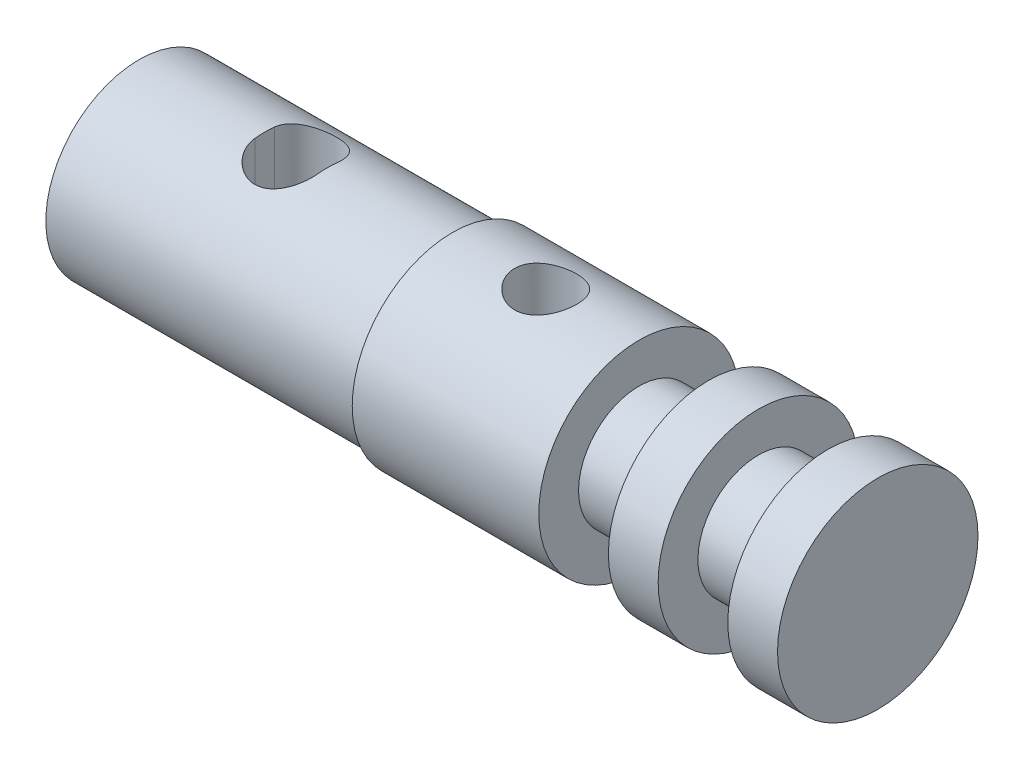
ISO-10303-21;
HEADER;
FILE_DESCRIPTION(('STEP AP214'),'2;1');
FILE_NAME('part.step','',(''),(''),'','','');
FILE_SCHEMA(('AUTOMOTIVE_DESIGN { 1 0 10303 214 1 1 1 1 }'));
ENDSEC;
DATA;
#1=APPLICATION_CONTEXT('core data for automotive mechanical design processes');
#2=APPLICATION_PROTOCOL_DEFINITION('international standard','automotive_design',2000,#1);
#3=PRODUCT_CONTEXT('',#1,'mechanical');
#4=PRODUCT('Part','Part','',(#3));
#5=PRODUCT_RELATED_PRODUCT_CATEGORY('part','',(#4));
#6=PRODUCT_DEFINITION_FORMATION('','',#4);
#7=PRODUCT_DEFINITION_CONTEXT('part definition',#1,'design');
#8=PRODUCT_DEFINITION('design','',#6,#7);
#9=PRODUCT_DEFINITION_SHAPE('','',#8);
#10=(LENGTH_UNIT() NAMED_UNIT(*) SI_UNIT(.MILLI.,.METRE.));
#11=(NAMED_UNIT(*) PLANE_ANGLE_UNIT() SI_UNIT($,.RADIAN.));
#12=(NAMED_UNIT(*) SI_UNIT($,.STERADIAN.) SOLID_ANGLE_UNIT());
#13=UNCERTAINTY_MEASURE_WITH_UNIT(LENGTH_MEASURE(1.E-05),#10,'distance_accuracy_value','');
#14=(GEOMETRIC_REPRESENTATION_CONTEXT(3) GLOBAL_UNCERTAINTY_ASSIGNED_CONTEXT((#13)) GLOBAL_UNIT_ASSIGNED_CONTEXT((#10,
#11,#12)) REPRESENTATION_CONTEXT('',''));
#15=CARTESIAN_POINT('',(0.,0.,0.));
#16=DIRECTION('',(0.,0.,1.));
#17=DIRECTION('',(1.,0.,0.));
#18=AXIS2_PLACEMENT_3D('',#15,#16,#17);
#19=CARTESIAN_POINT('',(-18.8585,0.,0.));
#20=DIRECTION('',(-1.,0.,0.));
#21=DIRECTION('',(0.,-1.,0.));
#22=AXIS2_PLACEMENT_3D('',#19,#20,#21);
#23=CYLINDRICAL_SURFACE('',#22,4.7625);
#24=CARTESIAN_POINT('',(-9.27100000000001,0.,0.));
#25=DIRECTION('',(-1.,0.,0.));
#26=DIRECTION('',(0.,-1.,0.));
#27=AXIS2_PLACEMENT_3D('',#24,#25,#26);
#28=CIRCLE('',#27,4.7625);
#29=CARTESIAN_POINT('',(-9.27100000000001,-4.73618066061663,-0.499999));
#30=VERTEX_POINT('',#29);
#31=CARTESIAN_POINT('',(-9.27100000000001,-4.73618066061663,0.499999));
#32=VERTEX_POINT('',#31);
#33=EDGE_CURVE('E125',#30,#32,#28,.T.);
#34=ORIENTED_EDGE('',*,*,#33,.F.);
#35=CARTESIAN_POINT('',(-9.271,-4.73618066061663,-0.499999));
#36=CARTESIAN_POINT('',(-9.27099900401879,-4.73149074957856,-0.544457113914548));
#37=CARTESIAN_POINT('',(-9.27286857671888,-4.72616979555771,-0.588823368380355));
#38=CARTESIAN_POINT('',(-9.28028499532807,-4.71433532449615,-0.677070814495245));
#39=CARTESIAN_POINT('',(-9.28583047912616,-4.70782224984331,-0.720952179699209));
#40=CARTESIAN_POINT('',(-9.30782761466854,-4.68665043825978,-0.851114215765219));
#41=CARTESIAN_POINT('',(-9.32964108379015,-4.67031999946661,-0.936277481682504));
#42=CARTESIAN_POINT('',(-9.38660216002771,-4.63424124740617,-1.10106514117091));
#43=CARTESIAN_POINT('',(-9.4217360664164,-4.61449645727916,-1.18069512674852));
#44=CARTESIAN_POINT('',(-9.50422379883291,-4.57288021799495,-1.33281533585361));
#45=CARTESIAN_POINT('',(-9.55158736122072,-4.55100708309077,-1.40529980681844));
#46=CARTESIAN_POINT('',(-9.65973672927317,-4.50567874360616,-1.54462863552813));
#47=CARTESIAN_POINT('',(-9.72103451625751,-4.48219680753337,-1.61106721460725));
#48=CARTESIAN_POINT('',(-9.85428731182231,-4.43654809058827,-1.7328248973506));
#49=CARTESIAN_POINT('',(-9.92624474941494,-4.41438161108545,-1.78814145985334));
#50=CARTESIAN_POINT('',(-10.0804386081246,-4.37312454910467,-1.88682267534422));
#51=CARTESIAN_POINT('',(-10.1628165503131,-4.35408672777652,-1.92998965839575));
#52=CARTESIAN_POINT('',(-10.3347950900228,-4.32167924492782,-2.00151257224924));
#53=CARTESIAN_POINT('',(-10.4243898259785,-4.3083050375166,-2.02988038583927));
#54=CARTESIAN_POINT('',(-10.6008831163809,-4.28971640151308,-2.0688578018687));
#55=CARTESIAN_POINT('',(-10.6874584269842,-4.28395316206478,-2.08066616262955));
#56=CARTESIAN_POINT('',(-10.8615391323911,-4.27946539742106,-2.08988386938572));
#57=CARTESIAN_POINT('',(-10.949044093646,-4.28073772356283,-2.08729965655974));
#58=CARTESIAN_POINT('',(-11.1156619012393,-4.28979667399263,-2.06860790446478));
#59=CARTESIAN_POINT('',(-11.1949182147864,-4.29709668291484,-2.05351024259698));
#60=CARTESIAN_POINT('',(-11.3496419002255,-4.31680883072445,-2.01173966499303));
#61=CARTESIAN_POINT('',(-11.4251086088033,-4.32922186109547,-1.98506473065171));
#62=CARTESIAN_POINT('',(-11.5729457873644,-4.3584668662552,-1.92002047325914));
#63=CARTESIAN_POINT('',(-11.6451326443969,-4.37543081548205,-1.88129520310794));
#64=CARTESIAN_POINT('',(-11.7822412799547,-4.41209075335578,-1.79363196292506));
#65=CARTESIAN_POINT('',(-11.8471602866535,-4.43178777797798,-1.74469011672339));
#66=CARTESIAN_POINT('',(-11.9742017056361,-4.47429966011795,-1.63277317400261));
#67=CARTESIAN_POINT('',(-12.0355114232409,-4.49723443599243,-1.56891924996947));
#68=CARTESIAN_POINT('',(-12.1467807022487,-4.54274331137461,-1.43181854778151));
#69=CARTESIAN_POINT('',(-12.196733940171,-4.56531720346459,-1.35856657196782));
#70=CARTESIAN_POINT('',(-12.285818565146,-4.60932632886207,-1.20103343674307));
#71=CARTESIAN_POINT('',(-12.3244027993718,-4.63067300410263,-1.11641680941919));
#72=CARTESIAN_POINT('',(-12.3863340533842,-4.66946691019947,-0.941014289018639));
#73=CARTESIAN_POINT('',(-12.4097071097766,-4.68692077044499,-0.850239232921642));
#74=CARTESIAN_POINT('',(-12.4319175886234,-4.70866798330001,-0.71534591868991));
#75=CARTESIAN_POINT('',(-12.437188325447,-4.71497573057759,-0.672527668170264));
#76=CARTESIAN_POINT('',(-12.4442275086746,-4.72644731574368,-0.586502061087986));
#77=CARTESIAN_POINT('',(-12.4459998763684,-4.73161242862544,-0.543295194776926));
#78=CARTESIAN_POINT('',(-12.446,-4.73618066061663,-0.499998999999999));
#79=B_SPLINE_CURVE_WITH_KNOTS('',3,(#35,#36,#37,#38,#39,#40,#41,#42,#43,#44,#45,#46,#47,#48,#49,
#50,#51,#52,#53,#54,#55,#56,#57,#58,#59,#60,#61,#62,#63,#64,#65,#66,#67,#68,#69,#70,#71,#72,#73,
#74,#75,#76,#77,#78),.UNSPECIFIED.,.F.,.F.,(4,2,2,2,2,2,2,2,2,2,2,2,2,2,2,2,2,2,2,2,2,4),(0.,
0.134023190107669,0.267996745584812,0.534858400956082,0.801446317321887,1.06824712946625,
1.34716758336556,1.62615169285082,1.90944220061474,2.19250489273292,2.45378087211084,
2.71493993077345,2.95686712657952,3.19883652159975,3.44876853385342,3.69879554324353,
3.97192549543557,4.24520716054719,4.5300487800395,4.81440155166159,4.9450673996194,
5.07558670206719),.UNSPECIFIED.);
#80=CARTESIAN_POINT('',(-12.446,-4.73618066061663,-0.499999));
#81=VERTEX_POINT('',#80);
#82=EDGE_CURVE('E166',#30,#81,#79,.T.);
#83=ORIENTED_EDGE('',*,*,#82,.T.);
#84=CARTESIAN_POINT('',(-12.446,0.,0.));
#85=DIRECTION('',(-1.,0.,0.));
#86=DIRECTION('',(0.,0.,1.));
#87=AXIS2_PLACEMENT_3D('',#84,#85,#86);
#88=CIRCLE('',#87,4.7625);
#89=CARTESIAN_POINT('',(-12.446,-4.73618066061663,0.499999));
#90=VERTEX_POINT('',#89);
#91=EDGE_CURVE('E154',#81,#90,#88,.T.);
#92=ORIENTED_EDGE('',*,*,#91,.T.);
#93=CARTESIAN_POINT('',(-12.446,-4.73618066061663,0.499999));
#94=CARTESIAN_POINT('',(-12.4460009959812,-4.73149074957856,0.544457113914548));
#95=CARTESIAN_POINT('',(-12.4441314232811,-4.72616979555771,0.588823368380356));
#96=CARTESIAN_POINT('',(-12.4367150046719,-4.71433532449615,0.677070814495245));
#97=CARTESIAN_POINT('',(-12.4311695208738,-4.70782224984331,0.72095217969921));
#98=CARTESIAN_POINT('',(-12.4091723853315,-4.68665043825978,0.851114215765219));
#99=CARTESIAN_POINT('',(-12.3873589162099,-4.67031999946661,0.936277481682504));
#100=CARTESIAN_POINT('',(-12.3303978399723,-4.63424124740617,1.10106514117091));
#101=CARTESIAN_POINT('',(-12.2952639335836,-4.61449645727916,1.18069512674852));
#102=CARTESIAN_POINT('',(-12.2127762011671,-4.57288021799495,1.33281533585361));
#103=CARTESIAN_POINT('',(-12.1654126387793,-4.55100708309077,1.40529980681844));
#104=CARTESIAN_POINT('',(-12.0572632707268,-4.50567874360616,1.54462863552813));
#105=CARTESIAN_POINT('',(-11.9959654837425,-4.48219680753337,1.61106721460725));
#106=CARTESIAN_POINT('',(-11.8627126881777,-4.43654809058827,1.7328248973506));
#107=CARTESIAN_POINT('',(-11.7907552505851,-4.41438161108545,1.78814145985334));
#108=CARTESIAN_POINT('',(-11.6365613918754,-4.37312454910467,1.88682267534422));
#109=CARTESIAN_POINT('',(-11.5541834496869,-4.35408672777652,1.92998965839575));
#110=CARTESIAN_POINT('',(-11.3822049099772,-4.32167924492783,2.00151257224924));
#111=CARTESIAN_POINT('',(-11.2926101740215,-4.3083050375166,2.02988038583927));
#112=CARTESIAN_POINT('',(-11.1161168836191,-4.28971640151308,2.0688578018687));
#113=CARTESIAN_POINT('',(-11.0295415730158,-4.28395316206478,2.08066616262955));
#114=CARTESIAN_POINT('',(-10.8554608676089,-4.27946539742106,2.08988386938572));
#115=CARTESIAN_POINT('',(-10.767955906354,-4.28073772356283,2.08729965655974));
#116=CARTESIAN_POINT('',(-10.6013380987607,-4.28979667399263,2.06860790446478));
#117=CARTESIAN_POINT('',(-10.5220817852136,-4.29709668291484,2.05351024259698));
#118=CARTESIAN_POINT('',(-10.3673580997745,-4.31680883072445,2.01173966499303));
#119=CARTESIAN_POINT('',(-10.2918913911967,-4.32922186109547,1.98506473065171));
#120=CARTESIAN_POINT('',(-10.1440542126356,-4.3584668662552,1.92002047325914));
#121=CARTESIAN_POINT('',(-10.0718673556031,-4.37543081548205,1.88129520310794));
#122=CARTESIAN_POINT('',(-9.93475872004533,-4.41209075335578,1.79363196292506));
#123=CARTESIAN_POINT('',(-9.8698397133465,-4.43178777797798,1.74469011672339));
#124=CARTESIAN_POINT('',(-9.74279829436393,-4.47429966011795,1.63277317400261));
#125=CARTESIAN_POINT('',(-9.68148857675908,-4.49723443599243,1.56891924996947));
#126=CARTESIAN_POINT('',(-9.57021929775134,-4.54274331137461,1.4318185477815));
#127=CARTESIAN_POINT('',(-9.52026605982898,-4.56531720346459,1.35856657196782));
#128=CARTESIAN_POINT('',(-9.43118143485397,-4.60932632886207,1.20103343674307));
#129=CARTESIAN_POINT('',(-9.39259720062818,-4.63067300410263,1.11641680941919));
#130=CARTESIAN_POINT('',(-9.33066594661583,-4.66946691019947,0.941014289018638));
#131=CARTESIAN_POINT('',(-9.30729289022338,-4.68692077044499,0.850239232921641));
#132=CARTESIAN_POINT('',(-9.28508241137656,-4.70866798330001,0.715345918689909));
#133=CARTESIAN_POINT('',(-9.27981167455298,-4.71497573057759,0.672527668170264));
#134=CARTESIAN_POINT('',(-9.27277249132541,-4.72644731574368,0.586502061087986));
#135=CARTESIAN_POINT('',(-9.27100012363155,-4.73161242862544,0.543295194776926));
#136=CARTESIAN_POINT('',(-9.271,-4.73618066061663,0.499998999999999));
#137=B_SPLINE_CURVE_WITH_KNOTS('',3,(#93,#94,#95,#96,#97,#98,#99,#100,#101,#102,#103,#104,#105,
#106,#107,#108,#109,#110,#111,#112,#113,#114,#115,#116,#117,#118,#119,#120,#121,#122,#123,#124,
#125,#126,#127,#128,#129,#130,#131,#132,#133,#134,#135,#136),.UNSPECIFIED.,.F.,.F.,(4,2,2,2,2,2,
2,2,2,2,2,2,2,2,2,2,2,2,2,2,2,4),(0.,0.134023190107669,0.267996745584813,0.534858400956083,
0.801446317321887,1.06824712946625,1.34716758336556,1.62615169285082,1.90944220061474,
2.19250489273293,2.45378087211085,2.71493993077345,2.95686712657952,3.19883652159975,
3.44876853385342,3.69879554324354,3.97192549543557,4.24520716054719,4.5300487800395,
4.81440155166159,4.9450673996194,5.07558670206719),.UNSPECIFIED.);
#138=EDGE_CURVE('E159',#90,#32,#137,.T.);
#139=ORIENTED_EDGE('',*,*,#138,.T.);
#140=EDGE_LOOP('',(#34,#83,#92,#139));
#141=FACE_BOUND('',#140,.T.);
#142=CARTESIAN_POINT('',(-18.8585,0.,0.));
#143=DIRECTION('',(-1.,0.,0.));
#144=DIRECTION('',(0.,-1.,0.));
#145=AXIS2_PLACEMENT_3D('',#142,#143,#144);
#146=CIRCLE('',#145,4.7625);
#147=CARTESIAN_POINT('',(-18.8585,-4.7625,0.));
#148=VERTEX_POINT('',#147);
#149=EDGE_CURVE('E170',#148,#148,#146,.T.);
#150=ORIENTED_EDGE('',*,*,#149,.F.);
#151=EDGE_LOOP('',(#150));
#152=FACE_BOUND('',#151,.T.);
#153=CARTESIAN_POINT('',(-2.8585,0.,0.));
#154=DIRECTION('',(-1.,0.,0.));
#155=DIRECTION('',(0.,-1.,0.));
#156=AXIS2_PLACEMENT_3D('',#153,#154,#155);
#157=CIRCLE('',#156,4.7625);
#158=CARTESIAN_POINT('',(-2.8585,-4.7625,0.));
#159=VERTEX_POINT('',#158);
#160=EDGE_CURVE('E391',#159,#159,#157,.T.);
#161=ORIENTED_EDGE('',*,*,#160,.T.);
#162=EDGE_LOOP('',(#161));
#163=FACE_BOUND('',#162,.T.);
#164=CARTESIAN_POINT('',(-9.271,4.73618066061663,0.499999));
#165=VERTEX_POINT('',#164);
#166=CARTESIAN_POINT('',(-9.271,4.73618066061663,-0.499999));
#167=VERTEX_POINT('',#166);
#168=EDGE_CURVE('E13',#165,#167,#28,.T.);
#169=ORIENTED_EDGE('',*,*,#168,.F.);
#170=CARTESIAN_POINT('',(-9.271,4.73618066061664,0.499999));
#171=CARTESIAN_POINT('',(-9.27099900401879,4.73149074957856,0.544457113914548));
#172=CARTESIAN_POINT('',(-9.27286857671888,4.72616979555771,0.588823368380355));
#173=CARTESIAN_POINT('',(-9.28028499532807,4.71433532449615,0.677070814495244));
#174=CARTESIAN_POINT('',(-9.28583047912616,4.70782224984332,0.720952179699209));
#175=CARTESIAN_POINT('',(-9.30782761466854,4.68665043825979,0.851114215765219));
#176=CARTESIAN_POINT('',(-9.32964108379015,4.67031999946661,0.936277481682504));
#177=CARTESIAN_POINT('',(-9.38660216002771,4.63424124740617,1.10106514117091));
#178=CARTESIAN_POINT('',(-9.4217360664164,4.61449645727917,1.18069512674852));
#179=CARTESIAN_POINT('',(-9.50422379883291,4.57288021799495,1.33281533585361));
#180=CARTESIAN_POINT('',(-9.55158736122072,4.55100708309078,1.40529980681844));
#181=CARTESIAN_POINT('',(-9.65973672927317,4.50567874360617,1.54462863552813));
#182=CARTESIAN_POINT('',(-9.72103451625751,4.48219680753337,1.61106721460725));
#183=CARTESIAN_POINT('',(-9.85428731182231,4.43654809058828,1.7328248973506));
#184=CARTESIAN_POINT('',(-9.92624474941494,4.41438161108546,1.78814145985334));
#185=CARTESIAN_POINT('',(-10.0804386081246,4.37312454910468,1.88682267534422));
#186=CARTESIAN_POINT('',(-10.1628165503131,4.35408672777652,1.92998965839575));
#187=CARTESIAN_POINT('',(-10.3347950900228,4.32167924492783,2.00151257224924));
#188=CARTESIAN_POINT('',(-10.4243898259785,4.30830503751661,2.02988038583927));
#189=CARTESIAN_POINT('',(-10.6008831163809,4.28971640151309,2.0688578018687));
#190=CARTESIAN_POINT('',(-10.6874584269842,4.28395316206478,2.08066616262955));
#191=CARTESIAN_POINT('',(-10.8615391323911,4.27946539742107,2.08988386938572));
#192=CARTESIAN_POINT('',(-10.949044093646,4.28073772356284,2.08729965655974));
#193=CARTESIAN_POINT('',(-11.1156619012393,4.28979667399263,2.06860790446478));
#194=CARTESIAN_POINT('',(-11.1949182147864,4.29709668291485,2.05351024259698));
#195=CARTESIAN_POINT('',(-11.3496419002255,4.31680883072446,2.01173966499303));
#196=CARTESIAN_POINT('',(-11.4251086088033,4.32922186109547,1.98506473065171));
#197=CARTESIAN_POINT('',(-11.5729457873644,4.35846686625521,1.92002047325914));
#198=CARTESIAN_POINT('',(-11.6451326443969,4.37543081548205,1.88129520310794));
#199=CARTESIAN_POINT('',(-11.7822412799547,4.41209075335579,1.79363196292506));
#200=CARTESIAN_POINT('',(-11.8471602866535,4.43178777797799,1.74469011672339));
#201=CARTESIAN_POINT('',(-11.9742017056361,4.47429966011796,1.63277317400261));
#202=CARTESIAN_POINT('',(-12.0355114232409,4.49723443599244,1.56891924996947));
#203=CARTESIAN_POINT('',(-12.1467807022487,4.54274331137462,1.4318185477815));
#204=CARTESIAN_POINT('',(-12.196733940171,4.56531720346459,1.35856657196782));
#205=CARTESIAN_POINT('',(-12.285818565146,4.60932632886208,1.20103343674307));
#206=CARTESIAN_POINT('',(-12.3244027993718,4.63067300410263,1.11641680941919));
#207=CARTESIAN_POINT('',(-12.3863340533842,4.66946691019948,0.941014289018638));
#208=CARTESIAN_POINT('',(-12.4097071097766,4.686920770445,0.850239232921641));
#209=CARTESIAN_POINT('',(-12.4319175886234,4.70866798330002,0.71534591868991));
#210=CARTESIAN_POINT('',(-12.437188325447,4.7149757305776,0.672527668170265));
#211=CARTESIAN_POINT('',(-12.4442275086746,4.72644731574369,0.586502061087987));
#212=CARTESIAN_POINT('',(-12.4459998763684,4.73161242862544,0.543295194776926));
#213=CARTESIAN_POINT('',(-12.446,4.73618066061664,0.499999));
#214=B_SPLINE_CURVE_WITH_KNOTS('',3,(#170,#171,#172,#173,#174,#175,#176,#177,#178,#179,#180,
#181,#182,#183,#184,#185,#186,#187,#188,#189,#190,#191,#192,#193,#194,#195,#196,#197,#198,#199,
#200,#201,#202,#203,#204,#205,#206,#207,#208,#209,#210,#211,#212,#213),.UNSPECIFIED.,.F.,.F.,(4,
2,2,2,2,2,2,2,2,2,2,2,2,2,2,2,2,2,2,2,2,4),(0.,0.134023190107669,0.267996745584812,
0.534858400956083,0.801446317321887,1.06824712946625,1.34716758336556,1.62615169285082,
1.90944220061474,2.19250489273292,2.45378087211085,2.71493993077346,2.95686712657952,
3.19883652159975,3.44876853385342,3.69879554324354,3.97192549543557,4.24520716054719,
4.5300487800395,4.81440155166159,4.9450673996194,5.07558670206719),.UNSPECIFIED.);
#215=CARTESIAN_POINT('',(-12.446,4.73618066061663,0.499999));
#216=VERTEX_POINT('',#215);
#217=EDGE_CURVE('E381',#165,#216,#214,.T.);
#218=ORIENTED_EDGE('',*,*,#217,.T.);
#219=CARTESIAN_POINT('',(-12.446,4.73618066061663,-0.499999));
#220=VERTEX_POINT('',#219);
#221=EDGE_CURVE('E162',#216,#220,#88,.T.);
#222=ORIENTED_EDGE('',*,*,#221,.T.);
#223=CARTESIAN_POINT('',(-12.446,4.73618066061664,-0.499998999999999));
#224=CARTESIAN_POINT('',(-12.4460009959812,4.73149074957857,-0.544457113914548));
#225=CARTESIAN_POINT('',(-12.4441314232811,4.72616979555771,-0.588823368380355));
#226=CARTESIAN_POINT('',(-12.4367150046719,4.71433532449615,-0.677070814495244));
#227=CARTESIAN_POINT('',(-12.4311695208738,4.70782224984332,-0.720952179699209));
#228=CARTESIAN_POINT('',(-12.4091723853315,4.68665043825979,-0.851114215765218));
#229=CARTESIAN_POINT('',(-12.3873589162099,4.67031999946662,-0.936277481682503));
#230=CARTESIAN_POINT('',(-12.3303978399723,4.63424124740617,-1.10106514117091));
#231=CARTESIAN_POINT('',(-12.2952639335836,4.61449645727917,-1.18069512674852));
#232=CARTESIAN_POINT('',(-12.2127762011671,4.57288021799495,-1.33281533585361));
#233=CARTESIAN_POINT('',(-12.1654126387793,4.55100708309078,-1.40529980681844));
#234=CARTESIAN_POINT('',(-12.0572632707268,4.50567874360617,-1.54462863552813));
#235=CARTESIAN_POINT('',(-11.9959654837425,4.48219680753337,-1.61106721460725));
#236=CARTESIAN_POINT('',(-11.8627126881777,4.43654809058828,-1.73282489735059));
#237=CARTESIAN_POINT('',(-11.7907552505851,4.41438161108546,-1.78814145985334));
#238=CARTESIAN_POINT('',(-11.6365613918754,4.37312454910468,-1.88682267534422));
#239=CARTESIAN_POINT('',(-11.5541834496869,4.35408672777652,-1.92998965839575));
#240=CARTESIAN_POINT('',(-11.3822049099772,4.32167924492783,-2.00151257224924));
#241=CARTESIAN_POINT('',(-11.2926101740215,4.30830503751661,-2.02988038583927));
#242=CARTESIAN_POINT('',(-11.1161168836191,4.28971640151309,-2.0688578018687));
#243=CARTESIAN_POINT('',(-11.0295415730158,4.28395316206478,-2.08066616262955));
#244=CARTESIAN_POINT('',(-10.8554608676089,4.27946539742107,-2.08988386938572));
#245=CARTESIAN_POINT('',(-10.767955906354,4.28073772356284,-2.08729965655974));
#246=CARTESIAN_POINT('',(-10.6013380987607,4.28979667399263,-2.06860790446478));
#247=CARTESIAN_POINT('',(-10.5220817852136,4.29709668291485,-2.05351024259698));
#248=CARTESIAN_POINT('',(-10.3673580997745,4.31680883072446,-2.01173966499303));
#249=CARTESIAN_POINT('',(-10.2918913911967,4.32922186109547,-1.98506473065171));
#250=CARTESIAN_POINT('',(-10.1440542126356,4.35846686625521,-1.92002047325914));
#251=CARTESIAN_POINT('',(-10.0718673556031,4.37543081548205,-1.88129520310794));
#252=CARTESIAN_POINT('',(-9.93475872004533,4.41209075335579,-1.79363196292506));
#253=CARTESIAN_POINT('',(-9.8698397133465,4.43178777797799,-1.74469011672339));
#254=CARTESIAN_POINT('',(-9.74279829436393,4.47429966011796,-1.63277317400261));
#255=CARTESIAN_POINT('',(-9.68148857675909,4.49723443599244,-1.56891924996947));
#256=CARTESIAN_POINT('',(-9.57021929775134,4.54274331137462,-1.43181854778151));
#257=CARTESIAN_POINT('',(-9.52026605982898,4.56531720346459,-1.35856657196782));
#258=CARTESIAN_POINT('',(-9.43118143485397,4.60932632886208,-1.20103343674307));
#259=CARTESIAN_POINT('',(-9.39259720062818,4.63067300410263,-1.11641680941919));
#260=CARTESIAN_POINT('',(-9.33066594661583,4.66946691019948,-0.94101428901864));
#261=CARTESIAN_POINT('',(-9.30729289022338,4.686920770445,-0.850239232921642));
#262=CARTESIAN_POINT('',(-9.28508241137656,4.70866798330002,-0.71534591868991));
#263=CARTESIAN_POINT('',(-9.27981167455298,4.7149757305776,-0.672527668170265));
#264=CARTESIAN_POINT('',(-9.27277249132541,4.72644731574369,-0.586502061087987));
#265=CARTESIAN_POINT('',(-9.27100012363155,4.73161242862544,-0.543295194776926));
#266=CARTESIAN_POINT('',(-9.271,4.73618066061664,-0.499998999999999));
#267=B_SPLINE_CURVE_WITH_KNOTS('',3,(#223,#224,#225,#226,#227,#228,#229,#230,#231,#232,#233,
#234,#235,#236,#237,#238,#239,#240,#241,#242,#243,#244,#245,#246,#247,#248,#249,#250,#251,#252,
#253,#254,#255,#256,#257,#258,#259,#260,#261,#262,#263,#264,#265,#266),.UNSPECIFIED.,.F.,.F.,(4,
2,2,2,2,2,2,2,2,2,2,2,2,2,2,2,2,2,2,2,2,4),(0.,0.134023190107669,0.267996745584813,
0.534858400956082,0.801446317321887,1.06824712946625,1.34716758336555,1.62615169285082,
1.90944220061474,2.19250489273292,2.45378087211085,2.71493993077346,2.95686712657953,
3.19883652159975,3.44876853385342,3.69879554324354,3.97192549543556,4.24520716054719,
4.5300487800395,4.81440155166159,4.9450673996194,5.0755867020672),.UNSPECIFIED.);
#268=EDGE_CURVE('E113',#220,#167,#267,.T.);
#269=ORIENTED_EDGE('',*,*,#268,.T.);
#270=EDGE_LOOP('',(#169,#218,#222,#269));
#271=FACE_BOUND('',#270,.T.);
#272=ADVANCED_FACE('F109',(#141,#152,#163,#271),#23,.T.);
#273=CARTESIAN_POINT('',(-18.8585,4.7625,0.));
#274=DIRECTION('',(1.,0.,0.));
#275=DIRECTION('',(0.,1.,0.));
#276=AXIS2_PLACEMENT_3D('',#273,#274,#275);
#277=PLANE('',#276);
#278=ORIENTED_EDGE('',*,*,#149,.T.);
#279=EDGE_LOOP('',(#278));
#280=FACE_BOUND('',#279,.T.);
#281=ADVANCED_FACE('F111',(#280),#277,.F.);
#282=CARTESIAN_POINT('',(18.8585,0.,0.));
#283=DIRECTION('',(-1.,0.,0.));
#284=DIRECTION('',(0.,-1.,0.));
#285=AXIS2_PLACEMENT_3D('',#282,#283,#284);
#286=PLANE('',#285);
#287=CARTESIAN_POINT('',(18.8585,0.,0.));
#288=DIRECTION('',(-1.,0.,0.));
#289=DIRECTION('',(0.,-1.,0.));
#290=AXIS2_PLACEMENT_3D('',#287,#288,#289);
#291=CIRCLE('',#290,5.11809999999999);
#292=CARTESIAN_POINT('',(18.8585,-5.11809999999998,0.));
#293=VERTEX_POINT('',#292);
#294=EDGE_CURVE('E420',#293,#293,#291,.T.);
#295=ORIENTED_EDGE('',*,*,#294,.F.);
#296=EDGE_LOOP('',(#295));
#297=FACE_BOUND('',#296,.T.);
#298=ADVANCED_FACE('F249',(#297),#286,.F.);
#299=CARTESIAN_POINT('',(-18.8585,0.,0.));
#300=DIRECTION('',(-1.,0.,0.));
#301=DIRECTION('',(0.,-1.,0.));
#302=AXIS2_PLACEMENT_3D('',#299,#300,#301);
#303=CYLINDRICAL_SURFACE('',#302,5.11809999999999);
#304=CARTESIAN_POINT('',(16.3185,0.,0.));
#305=DIRECTION('',(-1.,0.,0.));
#306=DIRECTION('',(0.,-1.,0.));
#307=AXIS2_PLACEMENT_3D('',#304,#305,#306);
#308=CIRCLE('',#307,5.11809999999999);
#309=CARTESIAN_POINT('',(16.3185,-5.11809999999998,0.));
#310=VERTEX_POINT('',#309);
#311=EDGE_CURVE('E418',#310,#310,#308,.T.);
#312=ORIENTED_EDGE('',*,*,#311,.F.);
#313=EDGE_LOOP('',(#312));
#314=FACE_BOUND('',#313,.T.);
#315=ORIENTED_EDGE('',*,*,#294,.T.);
#316=EDGE_LOOP('',(#315));
#317=FACE_BOUND('',#316,.T.);
#318=ADVANCED_FACE('F246',(#314,#317),#303,.T.);
#319=CARTESIAN_POINT('',(16.3185,3.0861,0.));
#320=DIRECTION('',(1.,0.,0.));
#321=DIRECTION('',(0.,1.,0.));
#322=AXIS2_PLACEMENT_3D('',#319,#320,#321);
#323=PLANE('',#322);
#324=CARTESIAN_POINT('',(16.3185,0.,0.));
#325=DIRECTION('',(-1.,0.,0.));
#326=DIRECTION('',(0.,-1.,0.));
#327=AXIS2_PLACEMENT_3D('',#324,#325,#326);
#328=CIRCLE('',#327,3.0861);
#329=CARTESIAN_POINT('',(16.3185,-3.08609999999999,0.));
#330=VERTEX_POINT('',#329);
#331=EDGE_CURVE('E415',#330,#330,#328,.T.);
#332=ORIENTED_EDGE('',*,*,#331,.F.);
#333=EDGE_LOOP('',(#332));
#334=FACE_BOUND('',#333,.T.);
#335=ORIENTED_EDGE('',*,*,#311,.T.);
#336=EDGE_LOOP('',(#335));
#337=FACE_BOUND('',#336,.T.);
#338=ADVANCED_FACE('F242',(#334,#337),#323,.F.);
#339=CARTESIAN_POINT('',(-18.8585,0.,0.));
#340=DIRECTION('',(-1.,0.,0.));
#341=DIRECTION('',(0.,-1.,0.));
#342=AXIS2_PLACEMENT_3D('',#339,#340,#341);
#343=CYLINDRICAL_SURFACE('',#342,3.0861);
#344=CARTESIAN_POINT('',(12.7625,0.,0.));
#345=DIRECTION('',(-1.,0.,0.));
#346=DIRECTION('',(0.,-1.,0.));
#347=AXIS2_PLACEMENT_3D('',#344,#345,#346);
#348=CIRCLE('',#347,3.0861);
#349=CARTESIAN_POINT('',(12.7625,-3.08609999999999,0.));
#350=VERTEX_POINT('',#349);
#351=EDGE_CURVE('E412',#350,#350,#348,.T.);
#352=ORIENTED_EDGE('',*,*,#351,.F.);
#353=EDGE_LOOP('',(#352));
#354=FACE_BOUND('',#353,.T.);
#355=ORIENTED_EDGE('',*,*,#331,.T.);
#356=EDGE_LOOP('',(#355));
#357=FACE_BOUND('',#356,.T.);
#358=ADVANCED_FACE('F238',(#354,#357),#343,.T.);
#359=CARTESIAN_POINT('',(12.7625,5.11809999999999,0.));
#360=DIRECTION('',(-1.,0.,0.));
#361=DIRECTION('',(0.,-1.,0.));
#362=AXIS2_PLACEMENT_3D('',#359,#360,#361);
#363=PLANE('',#362);
#364=CARTESIAN_POINT('',(12.7625,0.,0.));
#365=DIRECTION('',(-1.,0.,0.));
#366=DIRECTION('',(0.,-1.,0.));
#367=AXIS2_PLACEMENT_3D('',#364,#365,#366);
#368=CIRCLE('',#367,5.11809999999999);
#369=CARTESIAN_POINT('',(12.7625,-5.11809999999998,0.));
#370=VERTEX_POINT('',#369);
#371=EDGE_CURVE('E409',#370,#370,#368,.T.);
#372=ORIENTED_EDGE('',*,*,#371,.F.);
#373=EDGE_LOOP('',(#372));
#374=FACE_BOUND('',#373,.T.);
#375=ORIENTED_EDGE('',*,*,#351,.T.);
#376=EDGE_LOOP('',(#375));
#377=FACE_BOUND('',#376,.T.);
#378=ADVANCED_FACE('F234',(#374,#377),#363,.F.);
#379=CARTESIAN_POINT('',(-18.8585,0.,0.));
#380=DIRECTION('',(-1.,0.,0.));
#381=DIRECTION('',(0.,-1.,0.));
#382=AXIS2_PLACEMENT_3D('',#379,#380,#381);
#383=CYLINDRICAL_SURFACE('',#382,5.11809999999999);
#384=CARTESIAN_POINT('',(10.2225,0.,0.));
#385=DIRECTION('',(-1.,0.,0.));
#386=DIRECTION('',(0.,-1.,0.));
#387=AXIS2_PLACEMENT_3D('',#384,#385,#386);
#388=CIRCLE('',#387,5.11809999999999);
#389=CARTESIAN_POINT('',(10.2225,-5.11809999999998,0.));
#390=VERTEX_POINT('',#389);
#391=EDGE_CURVE('E406',#390,#390,#388,.T.);
#392=ORIENTED_EDGE('',*,*,#391,.F.);
#393=EDGE_LOOP('',(#392));
#394=FACE_BOUND('',#393,.T.);
#395=ORIENTED_EDGE('',*,*,#371,.T.);
#396=EDGE_LOOP('',(#395));
#397=FACE_BOUND('',#396,.T.);
#398=ADVANCED_FACE('F230',(#394,#397),#383,.T.);
#399=CARTESIAN_POINT('',(10.2225,3.0861,0.));
#400=DIRECTION('',(1.,0.,0.));
#401=DIRECTION('',(0.,1.,0.));
#402=AXIS2_PLACEMENT_3D('',#399,#400,#401);
#403=PLANE('',#402);
#404=CARTESIAN_POINT('',(10.2225,0.,0.));
#405=DIRECTION('',(-1.,0.,0.));
#406=DIRECTION('',(0.,-1.,0.));
#407=AXIS2_PLACEMENT_3D('',#404,#405,#406);
#408=CIRCLE('',#407,3.0861);
#409=CARTESIAN_POINT('',(10.2225,-3.08609999999999,0.));
#410=VERTEX_POINT('',#409);
#411=EDGE_CURVE('E403',#410,#410,#408,.T.);
#412=ORIENTED_EDGE('',*,*,#411,.F.);
#413=EDGE_LOOP('',(#412));
#414=FACE_BOUND('',#413,.T.);
#415=ORIENTED_EDGE('',*,*,#391,.T.);
#416=EDGE_LOOP('',(#415));
#417=FACE_BOUND('',#416,.T.);
#418=ADVANCED_FACE('F226',(#414,#417),#403,.F.);
#419=CARTESIAN_POINT('',(-18.8585,0.,0.));
#420=DIRECTION('',(-1.,0.,0.));
#421=DIRECTION('',(0.,-1.,0.));
#422=AXIS2_PLACEMENT_3D('',#419,#420,#421);
#423=CYLINDRICAL_SURFACE('',#422,3.0861);
#424=CARTESIAN_POINT('',(6.6665,0.,0.));
#425=DIRECTION('',(-1.,0.,0.));
#426=DIRECTION('',(0.,-1.,0.));
#427=AXIS2_PLACEMENT_3D('',#424,#425,#426);
#428=CIRCLE('',#427,3.0861);
#429=CARTESIAN_POINT('',(6.6665,-3.08609999999999,0.));
#430=VERTEX_POINT('',#429);
#431=EDGE_CURVE('E400',#430,#430,#428,.T.);
#432=ORIENTED_EDGE('',*,*,#431,.F.);
#433=EDGE_LOOP('',(#432));
#434=FACE_BOUND('',#433,.T.);
#435=ORIENTED_EDGE('',*,*,#411,.T.);
#436=EDGE_LOOP('',(#435));
#437=FACE_BOUND('',#436,.T.);
#438=ADVANCED_FACE('F222',(#434,#437),#423,.T.);
#439=CARTESIAN_POINT('',(6.6665,5.11809999999999,0.));
#440=DIRECTION('',(-1.,0.,0.));
#441=DIRECTION('',(0.,-1.,0.));
#442=AXIS2_PLACEMENT_3D('',#439,#440,#441);
#443=PLANE('',#442);
#444=CARTESIAN_POINT('',(6.6665,0.,0.));
#445=DIRECTION('',(-1.,0.,0.));
#446=DIRECTION('',(0.,-1.,0.));
#447=AXIS2_PLACEMENT_3D('',#444,#445,#446);
#448=CIRCLE('',#447,5.11809999999999);
#449=CARTESIAN_POINT('',(6.6665,-5.11809999999999,0.));
#450=VERTEX_POINT('',#449);
#451=EDGE_CURVE('E397',#450,#450,#448,.T.);
#452=ORIENTED_EDGE('',*,*,#451,.F.);
#453=EDGE_LOOP('',(#452));
#454=FACE_BOUND('',#453,.T.);
#455=ORIENTED_EDGE('',*,*,#431,.T.);
#456=EDGE_LOOP('',(#455));
#457=FACE_BOUND('',#456,.T.);
#458=ADVANCED_FACE('F217',(#454,#457),#443,.F.);
#459=CARTESIAN_POINT('',(-18.8585,0.,0.));
#460=DIRECTION('',(-1.,0.,0.));
#461=DIRECTION('',(0.,-1.,0.));
#462=AXIS2_PLACEMENT_3D('',#459,#460,#461);
#463=CYLINDRICAL_SURFACE('',#462,5.11809999999999);
#464=CARTESIAN_POINT('',(3.4915,-5.11809999999999,0.));
#465=CARTESIAN_POINT('',(3.49149933697056,-5.11809950317125,-0.086950053034518));
#466=CARTESIAN_POINT('',(3.48433283120927,-5.11586327722187,-0.173906950077138));
#467=CARTESIAN_POINT('',(3.4559299513437,-5.10716149930753,-0.345279782099102));
#468=CARTESIAN_POINT('',(3.43469020267645,-5.10069493297199,-0.429695102567977));
#469=CARTESIAN_POINT('',(3.37892453692399,-5.08423930286564,-0.593488678045638));
#470=CARTESIAN_POINT('',(3.34441900428466,-5.07425564548101,-0.672874444622168));
#471=CARTESIAN_POINT('',(3.26318739265303,-5.05179795005431,-0.824733322249257));
#472=CARTESIAN_POINT('',(3.21645944344683,-5.03932353095734,-0.89720537307908));
#473=CARTESIAN_POINT('',(3.1106100923704,-5.01278446313366,-1.03538853760576));
#474=CARTESIAN_POINT('',(3.05118359850261,-4.99868555277401,-1.10085934494505));
#475=CARTESIAN_POINT('',(2.92227378358607,-4.97068609824202,-1.22108366190875));
#476=CARTESIAN_POINT('',(2.85278862914253,-4.95678559074115,-1.27583521344242));
#477=CARTESIAN_POINT('',(2.70366246599129,-4.93039014838114,-1.37436255635996));
#478=CARTESIAN_POINT('',(2.6238157709531,-4.9179375553652,-1.41783944860849));
#479=CARTESIAN_POINT('',(2.45749547005231,-4.89636257053133,-1.49064873021235));
#480=CARTESIAN_POINT('',(2.37102358721597,-4.88723931637858,-1.51998478283089));
#481=CARTESIAN_POINT('',(2.19661675574739,-4.87371410357855,-1.56280274262022));
#482=CARTESIAN_POINT('',(2.10880166003282,-4.8691798915567,-1.57672990568793));
#483=CARTESIAN_POINT('',(1.93197322243193,-4.86495333032761,-1.58972566108754));
#484=CARTESIAN_POINT('',(1.84296019977373,-4.86525971574324,-1.5887981365719));
#485=CARTESIAN_POINT('',(1.66993394538442,-4.87056290318171,-1.57245937513849));
#486=CARTESIAN_POINT('',(1.58586086903012,-4.87537690240641,-1.55761259372913));
#487=CARTESIAN_POINT('',(1.42146320066296,-4.88885616533202,-1.51477134306824));
#488=CARTESIAN_POINT('',(1.34113900261385,-4.89752183279624,-1.48677549540677));
#489=CARTESIAN_POINT('',(1.18516776214788,-4.91786921890967,-1.41802897276914));
#490=CARTESIAN_POINT('',(1.10960500359658,-4.92959268126257,-1.37709996063739));
#491=CARTESIAN_POINT('',(0.966234170531787,-4.95471541606552,-1.28377280507735));
#492=CARTESIAN_POINT('',(0.898428092042923,-4.96811511801307,-1.231371719606));
#493=CARTESIAN_POINT('',(0.769302309933381,-4.99581539341739,-1.11381175266886));
#494=CARTESIAN_POINT('',(0.708409385801124,-5.01012942978395,-1.04818642859373));
#495=CARTESIAN_POINT('',(0.598390162125005,-5.03751552517131,-0.90747747365904));
#496=CARTESIAN_POINT('',(0.549264708671934,-5.05058749484576,-0.832393163282513));
#497=CARTESIAN_POINT('',(0.463891461732986,-5.0741503926482,-0.67408397921633));
#498=CARTESIAN_POINT('',(0.427744115794065,-5.08462100290095,-0.590801707801949));
#499=CARTESIAN_POINT('',(0.370098150450461,-5.10165481449346,-0.418938566435004));
#500=CARTESIAN_POINT('',(0.348595151685618,-5.10821918391184,-0.330359289167854));
#501=CARTESIAN_POINT('',(0.321572157072305,-5.1165135338062,-0.154040233259841));
#502=CARTESIAN_POINT('',(0.315474283566936,-5.11841821766006,-0.0663971096543557));
#503=CARTESIAN_POINT('',(0.317807129384173,-5.11769449895443,0.108668775368014));
#504=CARTESIAN_POINT('',(0.326235761202809,-5.11506674771991,0.19609156663941));
#505=CARTESIAN_POINT('',(0.356917794234668,-5.1056881350922,0.366015252622333));
#506=CARTESIAN_POINT('',(0.378828508843006,-5.09903954482237,0.44858420937646));
#507=CARTESIAN_POINT('',(0.435435700759922,-5.08239549275471,0.608851849192855));
#508=CARTESIAN_POINT('',(0.470133749928351,-5.07239961951202,0.686549932137331));
#509=CARTESIAN_POINT('',(0.552268338408185,-5.04978989054784,0.836957042446583));
#510=CARTESIAN_POINT('',(0.599992303158653,-5.03711863504352,0.909500247049971));
#511=CARTESIAN_POINT('',(0.706478346260375,-5.01060819915248,1.04574293737761));
#512=CARTESIAN_POINT('',(0.765243375995464,-4.99676870703079,1.10944005051958));
#513=CARTESIAN_POINT('',(0.894860986996529,-4.96880281885,1.22876022381913));
#514=CARTESIAN_POINT('',(0.966095589133033,-4.95468628213438,1.28397153350822));
#515=CARTESIAN_POINT('',(1.11712547237295,-4.9283308597893,1.38169210119582));
#516=CARTESIAN_POINT('',(1.19692059912116,-4.9160919403141,1.42420158816917));
#517=CARTESIAN_POINT('',(1.36262349267618,-4.89501438802272,1.4950419791955));
#518=CARTESIAN_POINT('',(1.4485049553694,-4.88616206808863,1.52343009834182));
#519=CARTESIAN_POINT('',(1.62415896620874,-4.87293033726369,1.56524370390156));
#520=CARTESIAN_POINT('',(1.71393004897157,-4.8685492568834,1.57867477520868));
#521=CARTESIAN_POINT('',(1.89051577215833,-4.86492823291631,1.5897959429571));
#522=CARTESIAN_POINT('',(1.97728393583935,-4.86546793047389,1.58816069321064));
#523=CARTESIAN_POINT('',(2.14924506804068,-4.87109338070888,1.57082083154519));
#524=CARTESIAN_POINT('',(2.23443810783528,-4.87617892717045,1.55511685783333));
#525=CARTESIAN_POINT('',(2.39964388244452,-4.89017022914329,1.51053396020693));
#526=CARTESIAN_POINT('',(2.47971301477734,-4.89902068995667,1.48184536367911));
#527=CARTESIAN_POINT('',(2.63396532029415,-4.91953120714028,1.41225710284692));
#528=CARTESIAN_POINT('',(2.70814730526574,-4.9311918287824,1.3713549813609));
#529=CARTESIAN_POINT('',(2.85162033775993,-4.95657069099297,1.27665289611534));
#530=CARTESIAN_POINT('',(2.9206118669058,-4.97035100358676,1.22241583473734));
#531=CARTESIAN_POINT('',(3.04873280683684,-4.99812812987512,1.10335590872459));
#532=CARTESIAN_POINT('',(3.10785958663089,-5.0121250002428,1.03853022913249));
#533=CARTESIAN_POINT('',(3.21646487043347,-5.03929535276874,0.897637098472492));
#534=CARTESIAN_POINT('',(3.26557413482734,-5.05242816024056,0.821276319162466));
#535=CARTESIAN_POINT('',(3.35019269336396,-5.07588463172026,0.660975496235889));
#536=CARTESIAN_POINT('',(3.38570752842189,-5.0862094397349,0.577038557840833));
#537=CARTESIAN_POINT('',(3.43943486356127,-5.10213231692663,0.411668462575192));
#538=CARTESIAN_POINT('',(3.45890368232078,-5.10806868418528,0.330674760971251));
#539=CARTESIAN_POINT('',(3.48493530741308,-5.11605238369096,0.166455837199794));
#540=CARTESIAN_POINT('',(3.49150063467056,-5.11810047557852,0.0832310541345659));
#541=CARTESIAN_POINT('',(3.4915,-5.11809999999999,0.));
#542=B_SPLINE_CURVE_WITH_KNOTS('',3,(#464,#465,#466,#467,#468,#469,#470,#471,#472,#473,#474,
#475,#476,#477,#478,#479,#480,#481,#482,#483,#484,#485,#486,#487,#488,#489,#490,#491,#492,#493,
#494,#495,#496,#497,#498,#499,#500,#501,#502,#503,#504,#505,#506,#507,#508,#509,#510,#511,#512,
#513,#514,#515,#516,#517,#518,#519,#520,#521,#522,#523,#524,#525,#526,#527,#528,#529,#530,#531,
#532,#533,#534,#535,#536,#537,#538,#539,#540,#541),.UNSPECIFIED.,.T.,.F.,(4,2,2,2,2,2,2,2,2,2,2,
2,2,2,2,2,2,2,2,2,2,2,2,2,2,2,2,2,2,2,2,2,2,2,2,2,2,2,4),(0.,0.260544267330669,
0.521151032081215,0.781358934030432,1.04160667502491,1.30900090034879,1.57644392520147,
1.85038302896571,2.12425112909089,2.38998020707591,2.65563982216094,2.91097192969555,
3.16633080954159,3.4253769639687,3.68448962943849,3.95521261282642,4.22595505558005,
4.49874997076136,4.77146327135284,5.03378354845743,5.29606613246581,5.55194268075958,
5.80785069270971,6.06993952127308,6.33209850865693,6.6044812763051,6.87685913343282,
7.14812422958382,7.41928800258269,7.67837049611954,7.93744123735187,8.19283171818757,
8.44827361449054,8.71358037896307,8.97895778970639,9.25282626934184,9.52658300453279,
9.77603209779264,10.0254324519252),.UNSPECIFIED.);
#543=CARTESIAN_POINT('',(3.4915,-5.11809999999999,0.));
#544=VERTEX_POINT('',#543);
#545=EDGE_CURVE('E160',#544,#544,#542,.T.);
#546=ORIENTED_EDGE('',*,*,#545,.T.);
#547=EDGE_LOOP('',(#546));
#548=FACE_BOUND('',#547,.T.);
#549=CARTESIAN_POINT('',(0.316500000000003,5.1181,0.));
#550=CARTESIAN_POINT('',(0.316500663029445,5.11809950317127,-0.0869500530345177));
#551=CARTESIAN_POINT('',(0.323667168790728,5.11586327722188,-0.173906950077137));
#552=CARTESIAN_POINT('',(0.352070048656303,5.10716149930753,-0.345279782099102));
#553=CARTESIAN_POINT('',(0.373309797323551,5.10069493297199,-0.429695102567977));
#554=CARTESIAN_POINT('',(0.429075463076016,5.08423930286564,-0.593488678045637));
#555=CARTESIAN_POINT('',(0.463580995715339,5.07425564548102,-0.672874444622168));
#556=CARTESIAN_POINT('',(0.544812607346975,5.05179795005431,-0.824733322249257));
#557=CARTESIAN_POINT('',(0.591540556553174,5.03932353095735,-0.897205373079079));
#558=CARTESIAN_POINT('',(0.697389907629599,5.01278446313367,-1.03538853760576));
#559=CARTESIAN_POINT('',(0.756816401497391,4.99868555277402,-1.10085934494505));
#560=CARTESIAN_POINT('',(0.885726216413934,4.97068609824203,-1.22108366190875));
#561=CARTESIAN_POINT('',(0.955211370857474,4.95678559074116,-1.27583521344242));
#562=CARTESIAN_POINT('',(1.10433753400871,4.93039014838115,-1.37436255635996));
#563=CARTESIAN_POINT('',(1.1841842290469,4.91793755536521,-1.41783944860849));
#564=CARTESIAN_POINT('',(1.35050452994769,4.89636257053134,-1.49064873021235));
#565=CARTESIAN_POINT('',(1.43697641278404,4.88723931637858,-1.51998478283089));
#566=CARTESIAN_POINT('',(1.61138324425261,4.87371410357856,-1.56280274262022));
#567=CARTESIAN_POINT('',(1.69919833996719,4.86917989155671,-1.57672990568793));
#568=CARTESIAN_POINT('',(1.87602677756808,4.86495333032762,-1.58972566108754));
#569=CARTESIAN_POINT('',(1.96503980022627,4.86525971574324,-1.5887981365719));
#570=CARTESIAN_POINT('',(2.13806605461559,4.87056290318171,-1.57245937513849));
#571=CARTESIAN_POINT('',(2.22213913096989,4.87537690240642,-1.55761259372913));
#572=CARTESIAN_POINT('',(2.38653679933705,4.88885616533203,-1.51477134306824));
#573=CARTESIAN_POINT('',(2.46686099738615,4.89752183279625,-1.48677549540677));
#574=CARTESIAN_POINT('',(2.62283223785212,4.91786921890967,-1.41802897276914));
#575=CARTESIAN_POINT('',(2.69839499640343,4.92959268126257,-1.37709996063739));
#576=CARTESIAN_POINT('',(2.84176582946822,4.95471541606553,-1.28377280507735));
#577=CARTESIAN_POINT('',(2.90957190795708,4.96811511801308,-1.231371719606));
#578=CARTESIAN_POINT('',(3.03869769006662,4.99581539341739,-1.11381175266886));
#579=CARTESIAN_POINT('',(3.09959061419888,5.01012942978395,-1.04818642859373));
#580=CARTESIAN_POINT('',(3.209609837875,5.03751552517132,-0.907477473659041));
#581=CARTESIAN_POINT('',(3.25873529132807,5.05058749484576,-0.832393163282514));
#582=CARTESIAN_POINT('',(3.34410853826702,5.07415039264821,-0.67408397921633));
#583=CARTESIAN_POINT('',(3.38025588420594,5.08462100290096,-0.59080170780195));
#584=CARTESIAN_POINT('',(3.43790184954954,5.10165481449346,-0.418938566435005));
#585=CARTESIAN_POINT('',(3.45940484831438,5.10821918391185,-0.330359289167855));
#586=CARTESIAN_POINT('',(3.4864278429277,5.11651353380621,-0.154040233259841));
#587=CARTESIAN_POINT('',(3.49252571643307,5.11841821766006,-0.0663971096543558));
#588=CARTESIAN_POINT('',(3.49019287061583,5.11769449895443,0.108668775368014));
#589=CARTESIAN_POINT('',(3.48176423879719,5.11506674771991,0.19609156663941));
#590=CARTESIAN_POINT('',(3.45108220576533,5.1056881350922,0.366015252622332));
#591=CARTESIAN_POINT('',(3.429171491157,5.09903954482238,0.44858420937646));
#592=CARTESIAN_POINT('',(3.37256429924008,5.08239549275472,0.608851849192855));
#593=CARTESIAN_POINT('',(3.33786625007165,5.07239961951202,0.686549932137331));
#594=CARTESIAN_POINT('',(3.25573166159182,5.04978989054785,0.836957042446583));
#595=CARTESIAN_POINT('',(3.20800769684135,5.03711863504353,0.909500247049971));
#596=CARTESIAN_POINT('',(3.10152165373963,5.01060819915249,1.04574293737761));
#597=CARTESIAN_POINT('',(3.04275662400454,4.99676870703079,1.10944005051958));
#598=CARTESIAN_POINT('',(2.91313901300347,4.96880281885,1.22876022381913));
#599=CARTESIAN_POINT('',(2.84190441086697,4.95468628213439,1.28397153350821));
#600=CARTESIAN_POINT('',(2.69087452762706,4.92833085978931,1.38169210119582));
#601=CARTESIAN_POINT('',(2.61107940087884,4.9160919403141,1.42420158816917));
#602=CARTESIAN_POINT('',(2.44537650732382,4.89501438802273,1.4950419791955));
#603=CARTESIAN_POINT('',(2.3594950446306,4.88616206808863,1.52343009834182));
#604=CARTESIAN_POINT('',(2.18384103379126,4.87293033726369,1.56524370390156));
#605=CARTESIAN_POINT('',(2.09406995102843,4.8685492568834,1.57867477520868));
#606=CARTESIAN_POINT('',(1.91748422784167,4.86492823291631,1.5897959429571));
#607=CARTESIAN_POINT('',(1.83071606416066,4.8654679304739,1.58816069321064));
#608=CARTESIAN_POINT('',(1.65875493195932,4.87109338070888,1.57082083154519));
#609=CARTESIAN_POINT('',(1.57356189216472,4.87617892717046,1.55511685783333));
#610=CARTESIAN_POINT('',(1.40835611755548,4.8901702291433,1.51053396020693));
#611=CARTESIAN_POINT('',(1.32828698522266,4.89902068995667,1.48184536367911));
#612=CARTESIAN_POINT('',(1.17403467970585,4.91953120714029,1.41225710284692));
#613=CARTESIAN_POINT('',(1.09985269473426,4.9311918287824,1.3713549813609));
#614=CARTESIAN_POINT('',(0.956379662240072,4.95657069099298,1.27665289611534));
#615=CARTESIAN_POINT('',(0.887388133094198,4.97035100358677,1.22241583473734));
#616=CARTESIAN_POINT('',(0.759267193163165,4.99812812987512,1.10335590872459));
#617=CARTESIAN_POINT('',(0.700140413369117,5.01212500024281,1.03853022913249));
#618=CARTESIAN_POINT('',(0.591535129566535,5.03929535276875,0.897637098472492));
#619=CARTESIAN_POINT('',(0.542425865172658,5.05242816024057,0.821276319162466));
#620=CARTESIAN_POINT('',(0.457807306636046,5.07588463172026,0.660975496235889));
#621=CARTESIAN_POINT('',(0.42229247157811,5.0862094397349,0.577038557840833));
#622=CARTESIAN_POINT('',(0.368565136438735,5.10213231692663,0.411668462575192));
#623=CARTESIAN_POINT('',(0.349096317679223,5.10806868418528,0.330674760971251));
#624=CARTESIAN_POINT('',(0.323064692586926,5.11605238369097,0.166455837199794));
#625=CARTESIAN_POINT('',(0.316499365329437,5.11810047557854,0.083231054134566));
#626=CARTESIAN_POINT('',(0.316500000000003,5.1181,0.));
#627=B_SPLINE_CURVE_WITH_KNOTS('',3,(#549,#550,#551,#552,#553,#554,#555,#556,#557,#558,#559,
#560,#561,#562,#563,#564,#565,#566,#567,#568,#569,#570,#571,#572,#573,#574,#575,#576,#577,#578,
#579,#580,#581,#582,#583,#584,#585,#586,#587,#588,#589,#590,#591,#592,#593,#594,#595,#596,#597,
#598,#599,#600,#601,#602,#603,#604,#605,#606,#607,#608,#609,#610,#611,#612,#613,#614,#615,#616,
#617,#618,#619,#620,#621,#622,#623,#624,#625,#626),.UNSPECIFIED.,.T.,.F.,(4,2,2,2,2,2,2,2,2,2,2,
2,2,2,2,2,2,2,2,2,2,2,2,2,2,2,2,2,2,2,2,2,2,2,2,2,2,2,4),(0.,0.260544267330668,
0.521151032081215,0.781358934030433,1.04160667502491,1.30900090034879,1.57644392520147,
1.85038302896571,2.12425112909089,2.38998020707591,2.65563982216094,2.91097192969555,
3.16633080954159,3.4253769639687,3.6844896294385,3.95521261282642,4.22595505558005,
4.49874997076136,4.77146327135284,5.03378354845743,5.29606613246582,5.55194268075959,
5.80785069270971,6.06993952127308,6.33209850865693,6.6044812763051,6.87685913343282,
7.14812422958382,7.41928800258269,7.67837049611954,7.93744123735187,8.19283171818757,
8.44827361449054,8.71358037896307,8.9789577897064,9.25282626934185,9.5265830045328,
9.77603209779264,10.0254324519252),.UNSPECIFIED.);
#628=CARTESIAN_POINT('',(0.316500000000003,5.1181,0.));
#629=VERTEX_POINT('',#628);
#630=EDGE_CURVE('E202',#629,#629,#627,.T.);
#631=ORIENTED_EDGE('',*,*,#630,.T.);
#632=EDGE_LOOP('',(#631));
#633=FACE_BOUND('',#632,.T.);
#634=CARTESIAN_POINT('',(-2.8585,0.,0.));
#635=DIRECTION('',(-1.,0.,0.));
#636=DIRECTION('',(0.,-1.,0.));
#637=AXIS2_PLACEMENT_3D('',#634,#635,#636);
#638=CIRCLE('',#637,5.11809999999999);
#639=CARTESIAN_POINT('',(-2.8585,-5.11809999999998,0.));
#640=VERTEX_POINT('',#639);
#641=EDGE_CURVE('E394',#640,#640,#638,.T.);
#642=ORIENTED_EDGE('',*,*,#641,.F.);
#643=EDGE_LOOP('',(#642));
#644=FACE_BOUND('',#643,.T.);
#645=ORIENTED_EDGE('',*,*,#451,.T.);
#646=EDGE_LOOP('',(#645));
#647=FACE_BOUND('',#646,.T.);
#648=ADVANCED_FACE('F213',(#548,#633,#644,#647),#463,.T.);
#649=CARTESIAN_POINT('',(-2.8585,5.11809999999999,0.));
#650=DIRECTION('',(1.,0.,0.));
#651=DIRECTION('',(0.,1.,0.));
#652=AXIS2_PLACEMENT_3D('',#649,#650,#651);
#653=PLANE('',#652);
#654=ORIENTED_EDGE('',*,*,#160,.F.);
#655=EDGE_LOOP('',(#654));
#656=FACE_BOUND('',#655,.T.);
#657=ORIENTED_EDGE('',*,*,#641,.T.);
#658=EDGE_LOOP('',(#657));
#659=FACE_BOUND('',#658,.T.);
#660=ADVANCED_FACE('F198',(#656,#659),#653,.F.);
#661=CARTESIAN_POINT('',(1.904,-5.11809999999999,0.));
#662=DIRECTION('',(0.,-1.,0.));
#663=DIRECTION('',(0.,0.,-1.));
#664=AXIS2_PLACEMENT_3D('',#661,#662,#663);
#665=CYLINDRICAL_SURFACE('',#664,1.5875);
#666=ORIENTED_EDGE('',*,*,#630,.F.);
#667=EDGE_LOOP('',(#666));
#668=FACE_BOUND('',#667,.T.);
#669=ORIENTED_EDGE('',*,*,#545,.F.);
#670=EDGE_LOOP('',(#669));
#671=FACE_BOUND('',#670,.T.);
#672=ADVANCED_FACE('F192',(#668,#671),#665,.F.);
#673=CARTESIAN_POINT('',(-10.8585,-5.11809999999998,-0.499999));
#674=DIRECTION('',(0.,-1.,0.));
#675=DIRECTION('',(0.,0.,-1.));
#676=AXIS2_PLACEMENT_3D('',#673,#674,#675);
#677=CYLINDRICAL_SURFACE('',#676,1.58749999999999);
#678=DIRECTION('',(0.,1.,0.));
#679=VECTOR('',#678,1.);
#680=CARTESIAN_POINT('',(-9.271,5.1181,-0.499999));
#681=LINE('',#680,#679);
#682=EDGE_CURVE('E171',#30,#167,#681,.T.);
#683=ORIENTED_EDGE('',*,*,#682,.T.);
#684=ORIENTED_EDGE('',*,*,#268,.F.);
#685=DIRECTION('',(0.,-1.,0.));
#686=VECTOR('',#685,1.);
#687=CARTESIAN_POINT('',(-12.446,-5.11809999999998,-0.499999));
#688=LINE('',#687,#686);
#689=EDGE_CURVE('E132',#81,#220,#688,.F.);
#690=ORIENTED_EDGE('',*,*,#689,.F.);
#691=ORIENTED_EDGE('',*,*,#82,.F.);
#692=EDGE_LOOP('',(#683,#684,#690,#691));
#693=FACE_BOUND('',#692,.T.);
#694=ADVANCED_FACE('F165',(#693),#677,.F.);
#695=CARTESIAN_POINT('',(-10.8585,-5.11809999999998,0.499999));
#696=DIRECTION('',(0.,-1.,0.));
#697=DIRECTION('',(0.,0.,-1.));
#698=AXIS2_PLACEMENT_3D('',#695,#696,#697);
#699=CYLINDRICAL_SURFACE('',#698,1.58749999999999);
#700=DIRECTION('',(0.,-1.,0.));
#701=VECTOR('',#700,1.);
#702=CARTESIAN_POINT('',(-12.446,-5.11809999999998,0.499999));
#703=LINE('',#702,#701);
#704=EDGE_CURVE('E137',#216,#90,#703,.T.);
#705=ORIENTED_EDGE('',*,*,#704,.F.);
#706=ORIENTED_EDGE('',*,*,#217,.F.);
#707=DIRECTION('',(0.,1.,0.));
#708=VECTOR('',#707,1.);
#709=CARTESIAN_POINT('',(-9.271,5.1181,0.499999));
#710=LINE('',#709,#708);
#711=EDGE_CURVE('E377',#32,#165,#710,.T.);
#712=ORIENTED_EDGE('',*,*,#711,.F.);
#713=ORIENTED_EDGE('',*,*,#138,.F.);
#714=EDGE_LOOP('',(#705,#706,#712,#713));
#715=FACE_BOUND('',#714,.T.);
#716=ADVANCED_FACE('F191',(#715),#699,.F.);
#717=CARTESIAN_POINT('',(-9.271,5.1181,0.499999));
#718=DIRECTION('',(-1.,0.,0.));
#719=DIRECTION('',(0.,-1.,0.));
#720=AXIS2_PLACEMENT_3D('',#717,#718,#719);
#721=PLANE('',#720);
#722=ORIENTED_EDGE('',*,*,#168,.T.);
#723=ORIENTED_EDGE('',*,*,#682,.F.);
#724=ORIENTED_EDGE('',*,*,#33,.T.);
#725=ORIENTED_EDGE('',*,*,#711,.T.);
#726=EDGE_LOOP('',(#722,#723,#724,#725));
#727=FACE_BOUND('',#726,.T.);
#728=ADVANCED_FACE('F349',(#727),#721,.T.);
#729=CARTESIAN_POINT('',(-12.446,-5.11809999999998,0.499999));
#730=DIRECTION('',(-1.,0.,0.));
#731=DIRECTION('',(0.,0.,1.));
#732=AXIS2_PLACEMENT_3D('',#729,#730,#731);
#733=PLANE('',#732);
#734=ORIENTED_EDGE('',*,*,#704,.T.);
#735=ORIENTED_EDGE('',*,*,#91,.F.);
#736=ORIENTED_EDGE('',*,*,#689,.T.);
#737=ORIENTED_EDGE('',*,*,#221,.F.);
#738=EDGE_LOOP('',(#734,#735,#736,#737));
#739=FACE_BOUND('',#738,.T.);
#740=ADVANCED_FACE('F155',(#739),#733,.F.);
#741=CLOSED_SHELL('',(#272,#281,#298,#318,#338,#358,#378,#398,#418,#438,#458,#648,#660,#672,
#694,#716,#728,#740));
#742=MANIFOLD_SOLID_BREP('B2',#741);
#743=ADVANCED_BREP_SHAPE_REPRESENTATION('',(#18,#742),#14);
#744=SHAPE_DEFINITION_REPRESENTATION(#9,#743);
ENDSEC;
END-ISO-10303-21;
